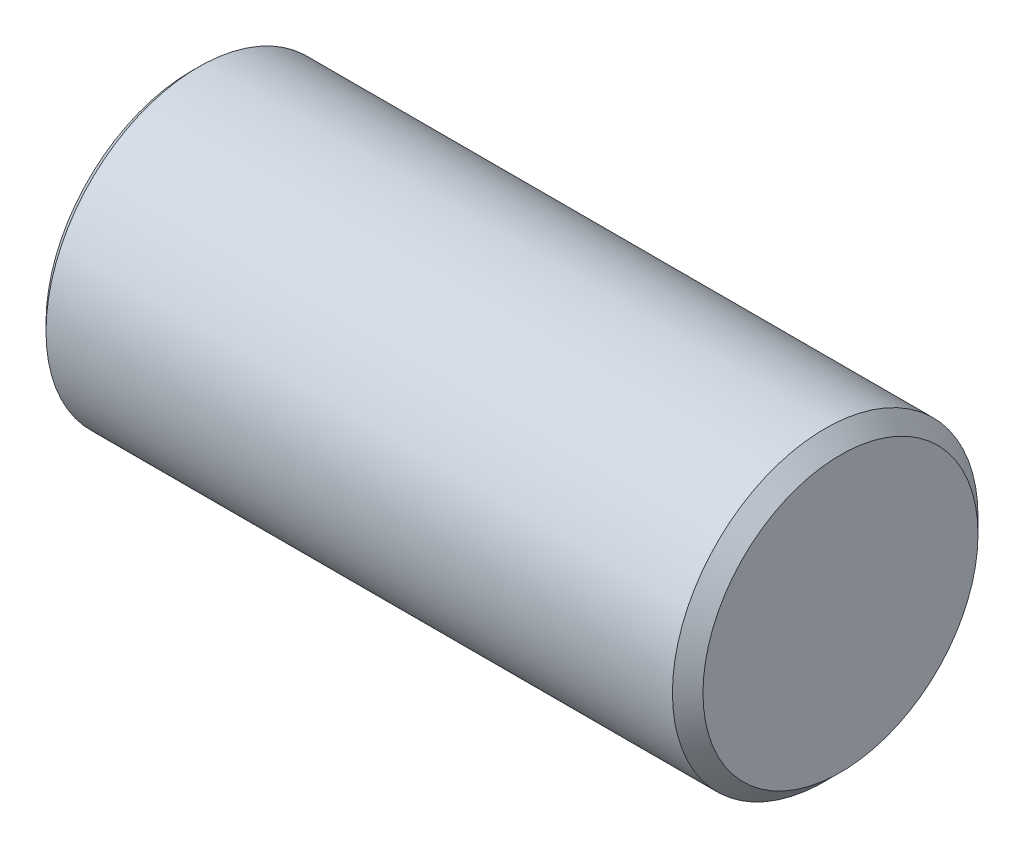
ISO-10303-21;
HEADER;
FILE_DESCRIPTION(('STEP AP214'),'2;1');
FILE_NAME('part.step','',(''),(''),'','','');
FILE_SCHEMA(('AUTOMOTIVE_DESIGN { 1 0 10303 214 1 1 1 1 }'));
ENDSEC;
DATA;
#1=APPLICATION_CONTEXT('core data for automotive mechanical design processes');
#2=APPLICATION_PROTOCOL_DEFINITION('international standard','automotive_design',2000,#1);
#3=PRODUCT_CONTEXT('',#1,'mechanical');
#4=PRODUCT('Part','Part','',(#3));
#5=PRODUCT_RELATED_PRODUCT_CATEGORY('part','',(#4));
#6=PRODUCT_DEFINITION_FORMATION('','',#4);
#7=PRODUCT_DEFINITION_CONTEXT('part definition',#1,'design');
#8=PRODUCT_DEFINITION('design','',#6,#7);
#9=PRODUCT_DEFINITION_SHAPE('','',#8);
#10=(LENGTH_UNIT() NAMED_UNIT(*) SI_UNIT(.MILLI.,.METRE.));
#11=(NAMED_UNIT(*) PLANE_ANGLE_UNIT() SI_UNIT($,.RADIAN.));
#12=(NAMED_UNIT(*) SI_UNIT($,.STERADIAN.) SOLID_ANGLE_UNIT());
#13=UNCERTAINTY_MEASURE_WITH_UNIT(LENGTH_MEASURE(1.E-05),#10,'distance_accuracy_value','');
#14=(GEOMETRIC_REPRESENTATION_CONTEXT(3) GLOBAL_UNCERTAINTY_ASSIGNED_CONTEXT((#13)) GLOBAL_UNIT_ASSIGNED_CONTEXT((#10,
#11,#12)) REPRESENTATION_CONTEXT('',''));
#15=CARTESIAN_POINT('',(0.,0.,0.));
#16=DIRECTION('',(0.,0.,1.));
#17=DIRECTION('',(1.,0.,0.));
#18=AXIS2_PLACEMENT_3D('',#15,#16,#17);
#19=CARTESIAN_POINT('',(92.6528747196546,0.,0.));
#20=DIRECTION('',(1.,0.,0.));
#21=DIRECTION('',(0.,0.,-1.));
#22=AXIS2_PLACEMENT_3D('',#19,#20,#21);
#23=PLANE('',#22);
#24=CARTESIAN_POINT('',(92.6528747196546,0.,0.));
#25=DIRECTION('',(1.,0.,0.));
#26=DIRECTION('',(0.,0.,-1.));
#27=AXIS2_PLACEMENT_3D('',#24,#25,#26);
#28=CIRCLE('',#27,18.);
#29=CARTESIAN_POINT('',(92.6528747196546,0.,-18.));
#30=VERTEX_POINT('',#29);
#31=EDGE_CURVE('E11',#30,#30,#28,.T.);
#32=ORIENTED_EDGE('',*,*,#31,.T.);
#33=EDGE_LOOP('',(#32));
#34=FACE_BOUND('',#33,.T.);
#35=ADVANCED_FACE('F35',(#34),#23,.T.);
#36=CARTESIAN_POINT('',(92.6528747196546,0.,0.));
#37=DIRECTION('',(-1.,0.,0.));
#38=DIRECTION('',(0.,0.,1.));
#39=AXIS2_PLACEMENT_3D('',#36,#37,#38);
#40=CONICAL_SURFACE('',#39,18.,0.785398163397452);
#41=CARTESIAN_POINT('',(90.6528747196546,0.,0.));
#42=DIRECTION('',(1.,0.,0.));
#43=DIRECTION('',(0.,0.,-1.));
#44=AXIS2_PLACEMENT_3D('',#41,#42,#43);
#45=CIRCLE('',#44,20.);
#46=CARTESIAN_POINT('',(90.6528747196546,0.,-20.));
#47=VERTEX_POINT('',#46);
#48=EDGE_CURVE('E41',#47,#47,#45,.T.);
#49=ORIENTED_EDGE('',*,*,#48,.T.);
#50=EDGE_LOOP('',(#49));
#51=FACE_BOUND('',#50,.T.);
#52=ORIENTED_EDGE('',*,*,#31,.F.);
#53=EDGE_LOOP('',(#52));
#54=FACE_BOUND('',#53,.T.);
#55=ADVANCED_FACE('F69',(#51,#54),#40,.T.);
#56=CARTESIAN_POINT('',(102.994030823935,0.,0.));
#57=DIRECTION('',(1.,0.,0.));
#58=DIRECTION('',(0.,0.,-1.));
#59=AXIS2_PLACEMENT_3D('',#56,#57,#58);
#60=CYLINDRICAL_SURFACE('',#59,20.);
#61=CARTESIAN_POINT('',(8.6528747196546,0.,0.));
#62=DIRECTION('',(1.,0.,0.));
#63=DIRECTION('',(0.,0.,-1.));
#64=AXIS2_PLACEMENT_3D('',#61,#62,#63);
#65=CIRCLE('',#64,20.);
#66=CARTESIAN_POINT('',(8.6528747196546,0.,-20.));
#67=VERTEX_POINT('',#66);
#68=EDGE_CURVE('E64',#67,#67,#65,.T.);
#69=ORIENTED_EDGE('',*,*,#68,.T.);
#70=EDGE_LOOP('',(#69));
#71=FACE_BOUND('',#70,.T.);
#72=ORIENTED_EDGE('',*,*,#48,.F.);
#73=EDGE_LOOP('',(#72));
#74=FACE_BOUND('',#73,.T.);
#75=ADVANCED_FACE('F72',(#71,#74),#60,.T.);
#76=CARTESIAN_POINT('',(8.6528747196546,0.,0.));
#77=DIRECTION('',(1.,0.,0.));
#78=DIRECTION('',(0.,0.,-1.));
#79=AXIS2_PLACEMENT_3D('',#76,#77,#78);
#80=CONICAL_SURFACE('',#79,20.,0.785398163397452);
#81=CARTESIAN_POINT('',(7.6528747196546,0.,0.));
#82=DIRECTION('',(1.,0.,0.));
#83=DIRECTION('',(0.,0.,-1.));
#84=AXIS2_PLACEMENT_3D('',#81,#82,#83);
#85=CIRCLE('',#84,19.);
#86=CARTESIAN_POINT('',(7.6528747196546,0.,-19.));
#87=VERTEX_POINT('',#86);
#88=EDGE_CURVE('E61',#87,#87,#85,.T.);
#89=ORIENTED_EDGE('',*,*,#88,.T.);
#90=EDGE_LOOP('',(#89));
#91=FACE_BOUND('',#90,.T.);
#92=ORIENTED_EDGE('',*,*,#68,.F.);
#93=EDGE_LOOP('',(#92));
#94=FACE_BOUND('',#93,.T.);
#95=ADVANCED_FACE('F74',(#91,#94),#80,.T.);
#96=CARTESIAN_POINT('',(7.6528747196546,0.,-19.));
#97=DIRECTION('',(-1.,0.,0.));
#98=DIRECTION('',(0.,0.,1.));
#99=AXIS2_PLACEMENT_3D('',#96,#97,#98);
#100=PLANE('',#99);
#101=CARTESIAN_POINT('',(7.6528747196546,0.,0.));
#102=DIRECTION('',(1.,0.,0.));
#103=DIRECTION('',(0.,0.,-1.));
#104=AXIS2_PLACEMENT_3D('',#101,#102,#103);
#105=CIRCLE('',#104,14.7500466259145);
#106=CARTESIAN_POINT('',(7.6528747196546,0.,-14.7500466259145));
#107=VERTEX_POINT('',#106);
#108=EDGE_CURVE('E56',#107,#107,#105,.T.);
#109=ORIENTED_EDGE('',*,*,#108,.T.);
#110=EDGE_LOOP('',(#109));
#111=FACE_BOUND('',#110,.T.);
#112=ORIENTED_EDGE('',*,*,#88,.F.);
#113=EDGE_LOOP('',(#112));
#114=FACE_BOUND('',#113,.T.);
#115=ADVANCED_FACE('F81',(#111,#114),#100,.T.);
#116=CARTESIAN_POINT('',(7.6528747196546,0.,0.));
#117=DIRECTION('',(-1.,0.,0.));
#118=DIRECTION('',(0.,0.,1.));
#119=AXIS2_PLACEMENT_3D('',#116,#117,#118);
#120=CONICAL_SURFACE('',#119,14.7500466259145,0.785398163397447);
#121=CARTESIAN_POINT('',(8.6528747196546,0.,0.));
#122=DIRECTION('',(1.,0.,0.));
#123=DIRECTION('',(0.,0.,-1.));
#124=AXIS2_PLACEMENT_3D('',#121,#122,#123);
#125=CIRCLE('',#124,13.7500466259145);
#126=CARTESIAN_POINT('',(8.6528747196546,0.,-13.7500466259145));
#127=VERTEX_POINT('',#126);
#128=EDGE_CURVE('E53',#127,#127,#125,.T.);
#129=ORIENTED_EDGE('',*,*,#128,.T.);
#130=EDGE_LOOP('',(#129));
#131=FACE_BOUND('',#130,.T.);
#132=ORIENTED_EDGE('',*,*,#108,.F.);
#133=EDGE_LOOP('',(#132));
#134=FACE_BOUND('',#133,.T.);
#135=ADVANCED_FACE('F112',(#131,#134),#120,.F.);
#136=CARTESIAN_POINT('',(102.994030823935,0.,0.));
#137=DIRECTION('',(1.,0.,0.));
#138=DIRECTION('',(0.,0.,-1.));
#139=AXIS2_PLACEMENT_3D('',#136,#137,#138);
#140=CYLINDRICAL_SURFACE('',#139,13.7500466259145);
#141=CARTESIAN_POINT('',(64.3183175714958,0.,0.));
#142=DIRECTION('',(1.,0.,0.));
#143=DIRECTION('',(0.,0.,-1.));
#144=AXIS2_PLACEMENT_3D('',#141,#142,#143);
#145=CIRCLE('',#144,13.7500466259145);
#146=CARTESIAN_POINT('',(64.3183175714958,0.,-13.7500466259145));
#147=VERTEX_POINT('',#146);
#148=EDGE_CURVE('E51',#147,#147,#145,.T.);
#149=ORIENTED_EDGE('',*,*,#148,.T.);
#150=EDGE_LOOP('',(#149));
#151=FACE_BOUND('',#150,.T.);
#152=ORIENTED_EDGE('',*,*,#128,.F.);
#153=EDGE_LOOP('',(#152));
#154=FACE_BOUND('',#153,.T.);
#155=ADVANCED_FACE('F47',(#151,#154),#140,.F.);
#156=CARTESIAN_POINT('',(64.3183175714958,0.,0.));
#157=DIRECTION('',(-1.,0.,0.));
#158=DIRECTION('',(0.,0.,1.));
#159=AXIS2_PLACEMENT_3D('',#156,#157,#158);
#160=CONICAL_SURFACE('',#159,13.7500466259145,1.08209944928505);
#161=CARTESIAN_POINT('',(71.6294297140758,0.,0.));
#162=VERTEX_POINT('',#161);
#163=VERTEX_LOOP('',#162);
#164=FACE_BOUND('',#163,.T.);
#165=ORIENTED_EDGE('',*,*,#148,.F.);
#166=EDGE_LOOP('',(#165));
#167=FACE_BOUND('',#166,.T.);
#168=ADVANCED_FACE('F44',(#164,#167),#160,.F.);
#169=CLOSED_SHELL('',(#35,#55,#75,#95,#115,#135,#155,#168));
#170=MANIFOLD_SOLID_BREP('B2',#169);
#171=ADVANCED_BREP_SHAPE_REPRESENTATION('',(#18,#170),#14);
#172=SHAPE_DEFINITION_REPRESENTATION(#9,#171);
ENDSEC;
END-ISO-10303-21;
